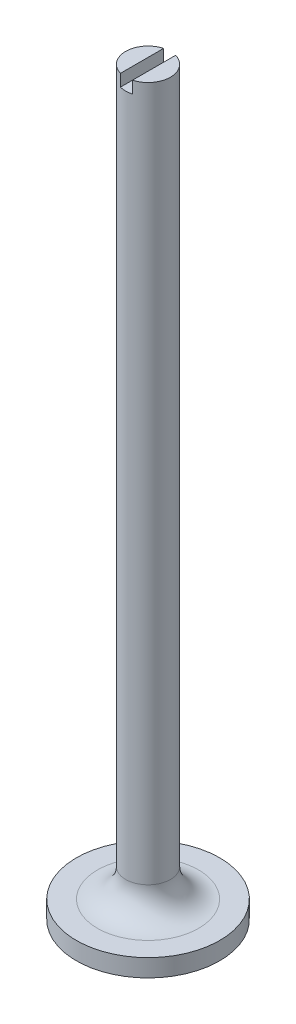
ISO-10303-21;
HEADER;
FILE_DESCRIPTION(('STEP AP214'),'2;1');
FILE_NAME('part.step','',(''),(''),'','','');
FILE_SCHEMA(('AUTOMOTIVE_DESIGN { 1 0 10303 214 1 1 1 1 }'));
ENDSEC;
DATA;
#1=APPLICATION_CONTEXT('core data for automotive mechanical design processes');
#2=APPLICATION_PROTOCOL_DEFINITION('international standard','automotive_design',2000,#1);
#3=PRODUCT_CONTEXT('',#1,'mechanical');
#4=PRODUCT('Part','Part','',(#3));
#5=PRODUCT_RELATED_PRODUCT_CATEGORY('part','',(#4));
#6=PRODUCT_DEFINITION_FORMATION('','',#4);
#7=PRODUCT_DEFINITION_CONTEXT('part definition',#1,'design');
#8=PRODUCT_DEFINITION('design','',#6,#7);
#9=PRODUCT_DEFINITION_SHAPE('','',#8);
#10=(LENGTH_UNIT() NAMED_UNIT(*) SI_UNIT(.MILLI.,.METRE.));
#11=(NAMED_UNIT(*) PLANE_ANGLE_UNIT() SI_UNIT($,.RADIAN.));
#12=(NAMED_UNIT(*) SI_UNIT($,.STERADIAN.) SOLID_ANGLE_UNIT());
#13=UNCERTAINTY_MEASURE_WITH_UNIT(LENGTH_MEASURE(1.E-05),#10,'distance_accuracy_value','');
#14=(GEOMETRIC_REPRESENTATION_CONTEXT(3) GLOBAL_UNCERTAINTY_ASSIGNED_CONTEXT((#13)) GLOBAL_UNIT_ASSIGNED_CONTEXT((#10,
#11,#12)) REPRESENTATION_CONTEXT('',''));
#15=CARTESIAN_POINT('',(0.,0.,0.));
#16=DIRECTION('',(0.,0.,1.));
#17=DIRECTION('',(1.,0.,0.));
#18=AXIS2_PLACEMENT_3D('',#15,#16,#17);
#19=CARTESIAN_POINT('',(3.175,105.,0.));
#20=DIRECTION('',(0.,1.,0.));
#21=DIRECTION('',(0.,0.,1.));
#22=AXIS2_PLACEMENT_3D('',#19,#20,#21);
#23=PLANE('',#22);
#24=DIRECTION('',(0.,0.,1.));
#25=VECTOR('',#24,1.);
#26=CARTESIAN_POINT('',(-0.850000000000013,105.,0.));
#27=LINE('',#26,#25);
#28=CARTESIAN_POINT('',(-0.850000000000013,105.,-3.05910526134685));
#29=VERTEX_POINT('',#28);
#30=CARTESIAN_POINT('',(-0.850000000000013,105.,3.05910526134685));
#31=VERTEX_POINT('',#30);
#32=EDGE_CURVE('E61',#29,#31,#27,.T.);
#33=ORIENTED_EDGE('',*,*,#32,.F.);
#34=CARTESIAN_POINT('',(0.,105.,0.));
#35=DIRECTION('',(0.,-1.,0.));
#36=DIRECTION('',(0.,0.,-1.));
#37=AXIS2_PLACEMENT_3D('',#34,#35,#36);
#38=CIRCLE('',#37,3.175);
#39=EDGE_CURVE('E96',#31,#29,#38,.T.);
#40=ORIENTED_EDGE('',*,*,#39,.F.);
#41=EDGE_LOOP('',(#33,#40));
#42=FACE_BOUND('',#41,.T.);
#43=ADVANCED_FACE('F38',(#42),#23,.T.);
#44=CARTESIAN_POINT('',(0.,0.,0.));
#45=DIRECTION('',(0.,-1.,0.));
#46=DIRECTION('',(0.,0.,-1.));
#47=AXIS2_PLACEMENT_3D('',#44,#45,#46);
#48=PLANE('',#47);
#49=CARTESIAN_POINT('',(0.,0.,0.));
#50=DIRECTION('',(0.,-1.,0.));
#51=DIRECTION('',(0.,0.,-1.));
#52=AXIS2_PLACEMENT_3D('',#49,#50,#51);
#53=CIRCLE('',#52,10.16);
#54=CARTESIAN_POINT('',(0.,0.,-10.16));
#55=VERTEX_POINT('',#54);
#56=EDGE_CURVE('E99',#55,#55,#53,.T.);
#57=ORIENTED_EDGE('',*,*,#56,.T.);
#58=EDGE_LOOP('',(#57));
#59=FACE_BOUND('',#58,.T.);
#60=ADVANCED_FACE('F126',(#59),#48,.T.);
#61=CARTESIAN_POINT('',(0.,-31.8317037555853,0.));
#62=DIRECTION('',(0.,-1.,0.));
#63=DIRECTION('',(0.,0.,-1.));
#64=AXIS2_PLACEMENT_3D('',#61,#62,#63);
#65=CYLINDRICAL_SURFACE('',#64,10.16);
#66=CARTESIAN_POINT('',(0.,2.5,0.));
#67=DIRECTION('',(0.,-1.,0.));
#68=DIRECTION('',(0.,0.,-1.));
#69=AXIS2_PLACEMENT_3D('',#66,#67,#68);
#70=CIRCLE('',#69,10.16);
#71=CARTESIAN_POINT('',(0.,2.5,-10.16));
#72=VERTEX_POINT('',#71);
#73=EDGE_CURVE('E95',#72,#72,#70,.T.);
#74=ORIENTED_EDGE('',*,*,#73,.T.);
#75=EDGE_LOOP('',(#74));
#76=FACE_BOUND('',#75,.T.);
#77=ORIENTED_EDGE('',*,*,#56,.F.);
#78=EDGE_LOOP('',(#77));
#79=FACE_BOUND('',#78,.T.);
#80=ADVANCED_FACE('F131',(#76,#79),#65,.T.);
#81=CARTESIAN_POINT('',(10.16,2.5,0.));
#82=DIRECTION('',(0.,1.,0.));
#83=DIRECTION('',(0.,0.,1.));
#84=AXIS2_PLACEMENT_3D('',#81,#82,#83);
#85=PLANE('',#84);
#86=CARTESIAN_POINT('',(0.,2.5,0.));
#87=DIRECTION('',(0.,1.,0.));
#88=DIRECTION('',(0.,0.,1.));
#89=AXIS2_PLACEMENT_3D('',#86,#87,#88);
#90=CIRCLE('',#89,7.175);
#91=CARTESIAN_POINT('',(0.,2.5,7.175));
#92=VERTEX_POINT('',#91);
#93=EDGE_CURVE('E108',#92,#92,#90,.F.);
#94=ORIENTED_EDGE('',*,*,#93,.T.);
#95=EDGE_LOOP('',(#94));
#96=FACE_BOUND('',#95,.T.);
#97=ORIENTED_EDGE('',*,*,#73,.F.);
#98=EDGE_LOOP('',(#97));
#99=FACE_BOUND('',#98,.T.);
#100=ADVANCED_FACE('F141',(#96,#99),#85,.T.);
#101=CARTESIAN_POINT('',(0.,-31.8317037555853,0.));
#102=DIRECTION('',(0.,-1.,0.));
#103=DIRECTION('',(0.,0.,-1.));
#104=AXIS2_PLACEMENT_3D('',#101,#102,#103);
#105=CYLINDRICAL_SURFACE('',#104,3.175);
#106=DIRECTION('',(0.,-1.,0.));
#107=VECTOR('',#106,1.);
#108=CARTESIAN_POINT('',(-0.85000000000003,-31.8317037555853,3.05910526134685));
#109=LINE('',#108,#107);
#110=CARTESIAN_POINT('',(-0.850000000000013,103.3,3.05910526134685));
#111=VERTEX_POINT('',#110);
#112=EDGE_CURVE('E119',#31,#111,#109,.T.);
#113=ORIENTED_EDGE('',*,*,#112,.F.);
#114=ORIENTED_EDGE('',*,*,#39,.T.);
#115=DIRECTION('',(0.,-1.,0.));
#116=VECTOR('',#115,1.);
#117=CARTESIAN_POINT('',(-0.85000000000003,-31.8317037555853,-3.05910526134685));
#118=LINE('',#117,#116);
#119=CARTESIAN_POINT('',(-0.850000000000013,103.3,-3.05910526134685));
#120=VERTEX_POINT('',#119);
#121=EDGE_CURVE('E102',#120,#29,#118,.F.);
#122=ORIENTED_EDGE('',*,*,#121,.F.);
#123=CARTESIAN_POINT('',(0.,103.3,0.));
#124=DIRECTION('',(0.,-1.,0.));
#125=DIRECTION('',(0.,0.,-1.));
#126=AXIS2_PLACEMENT_3D('',#123,#124,#125);
#127=CIRCLE('',#126,3.175);
#128=CARTESIAN_POINT('',(0.849999999999987,103.3,-3.05910526134686));
#129=VERTEX_POINT('',#128);
#130=EDGE_CURVE('E42',#129,#120,#127,.F.);
#131=ORIENTED_EDGE('',*,*,#130,.F.);
#132=DIRECTION('',(0.,-1.,0.));
#133=VECTOR('',#132,1.);
#134=CARTESIAN_POINT('',(0.849999999997988,-31.8317037555853,-3.05910526134741));
#135=LINE('',#134,#133);
#136=CARTESIAN_POINT('',(0.850000000000012,105.,-3.05910526134685));
#137=VERTEX_POINT('',#136);
#138=EDGE_CURVE('E79',#137,#129,#135,.T.);
#139=ORIENTED_EDGE('',*,*,#138,.F.);
#140=CARTESIAN_POINT('',(0.850000000000012,105.,3.05910526134685));
#141=VERTEX_POINT('',#140);
#142=EDGE_CURVE('E90',#137,#141,#38,.T.);
#143=ORIENTED_EDGE('',*,*,#142,.T.);
#144=DIRECTION('',(0.,-1.,0.));
#145=VECTOR('',#144,1.);
#146=CARTESIAN_POINT('',(0.849999999997988,-31.8317037555853,3.05910526134741));
#147=LINE('',#146,#145);
#148=CARTESIAN_POINT('',(0.849999999999987,103.3,3.05910526134686));
#149=VERTEX_POINT('',#148);
#150=EDGE_CURVE('E53',#149,#141,#147,.F.);
#151=ORIENTED_EDGE('',*,*,#150,.F.);
#152=EDGE_CURVE('E11',#111,#149,#127,.F.);
#153=ORIENTED_EDGE('',*,*,#152,.F.);
#154=EDGE_LOOP('',(#113,#114,#122,#131,#139,#143,#151,#153));
#155=FACE_BOUND('',#154,.T.);
#156=CARTESIAN_POINT('',(0.,6.5,0.));
#157=DIRECTION('',(0.,1.,0.));
#158=DIRECTION('',(0.,0.,1.));
#159=AXIS2_PLACEMENT_3D('',#156,#157,#158);
#160=CIRCLE('',#159,3.175);
#161=CARTESIAN_POINT('',(0.,6.5,3.175));
#162=VERTEX_POINT('',#161);
#163=EDGE_CURVE('E84',#162,#162,#160,.T.);
#164=ORIENTED_EDGE('',*,*,#163,.T.);
#165=EDGE_LOOP('',(#164));
#166=FACE_BOUND('',#165,.T.);
#167=ADVANCED_FACE('F88',(#155,#166),#105,.T.);
#168=DIRECTION('',(0.,0.,-1.));
#169=VECTOR('',#168,1.);
#170=CARTESIAN_POINT('',(0.850000000000012,105.,0.));
#171=LINE('',#170,#169);
#172=EDGE_CURVE('E76',#141,#137,#171,.T.);
#173=ORIENTED_EDGE('',*,*,#172,.F.);
#174=ORIENTED_EDGE('',*,*,#142,.F.);
#175=EDGE_LOOP('',(#173,#174));
#176=FACE_BOUND('',#175,.T.);
#177=ADVANCED_FACE('F94',(#176),#23,.T.);
#178=CARTESIAN_POINT('',(0.,6.5,0.));
#179=DIRECTION('',(0.,1.,0.));
#180=DIRECTION('',(0.,0.,1.));
#181=AXIS2_PLACEMENT_3D('',#178,#179,#180);
#182=TOROIDAL_SURFACE('',#181,7.175,4.);
#183=ORIENTED_EDGE('',*,*,#163,.F.);
#184=EDGE_LOOP('',(#183));
#185=FACE_BOUND('',#184,.T.);
#186=ORIENTED_EDGE('',*,*,#93,.F.);
#187=EDGE_LOOP('',(#186));
#188=FACE_BOUND('',#187,.T.);
#189=ADVANCED_FACE('F40',(#185,#188),#182,.F.);
#190=CARTESIAN_POINT('',(-0.850000000000013,105.,-10.16));
#191=DIRECTION('',(-1.,0.,0.));
#192=DIRECTION('',(0.,-1.,0.));
#193=AXIS2_PLACEMENT_3D('',#190,#191,#192);
#194=PLANE('',#193);
#195=ORIENTED_EDGE('',*,*,#121,.T.);
#196=ORIENTED_EDGE('',*,*,#32,.T.);
#197=ORIENTED_EDGE('',*,*,#112,.T.);
#198=DIRECTION('',(0.,0.,1.));
#199=VECTOR('',#198,1.);
#200=CARTESIAN_POINT('',(-0.850000000000013,103.3,-10.16));
#201=LINE('',#200,#199);
#202=EDGE_CURVE('E116',#120,#111,#201,.T.);
#203=ORIENTED_EDGE('',*,*,#202,.F.);
#204=EDGE_LOOP('',(#195,#196,#197,#203));
#205=FACE_BOUND('',#204,.T.);
#206=ADVANCED_FACE('F118',(#205),#194,.F.);
#207=CARTESIAN_POINT('',(0.850000000000012,105.,-10.16));
#208=DIRECTION('',(1.,0.,0.));
#209=DIRECTION('',(0.,1.,0.));
#210=AXIS2_PLACEMENT_3D('',#207,#208,#209);
#211=PLANE('',#210);
#212=ORIENTED_EDGE('',*,*,#150,.T.);
#213=ORIENTED_EDGE('',*,*,#172,.T.);
#214=ORIENTED_EDGE('',*,*,#138,.T.);
#215=DIRECTION('',(0.,0.,1.));
#216=VECTOR('',#215,1.);
#217=CARTESIAN_POINT('',(0.849999999999987,103.3,-10.16));
#218=LINE('',#217,#216);
#219=EDGE_CURVE('E92',#129,#149,#218,.T.);
#220=ORIENTED_EDGE('',*,*,#219,.T.);
#221=EDGE_LOOP('',(#212,#213,#214,#220));
#222=FACE_BOUND('',#221,.T.);
#223=ADVANCED_FACE('F78',(#222),#211,.F.);
#224=CARTESIAN_POINT('',(-0.850000000000013,103.3,-10.16));
#225=DIRECTION('',(0.,-1.,0.));
#226=DIRECTION('',(0.,0.,-1.));
#227=AXIS2_PLACEMENT_3D('',#224,#225,#226);
#228=PLANE('',#227);
#229=ORIENTED_EDGE('',*,*,#152,.T.);
#230=ORIENTED_EDGE('',*,*,#219,.F.);
#231=ORIENTED_EDGE('',*,*,#130,.T.);
#232=ORIENTED_EDGE('',*,*,#202,.T.);
#233=EDGE_LOOP('',(#229,#230,#231,#232));
#234=FACE_BOUND('',#233,.T.);
#235=ADVANCED_FACE('F115',(#234),#228,.F.);
#236=CLOSED_SHELL('',(#43,#60,#80,#100,#167,#177,#189,#206,#223,#235));
#237=MANIFOLD_SOLID_BREP('B2',#236);
#238=ADVANCED_BREP_SHAPE_REPRESENTATION('',(#18,#237),#14);
#239=SHAPE_DEFINITION_REPRESENTATION(#9,#238);
ENDSEC;
END-ISO-10303-21;
